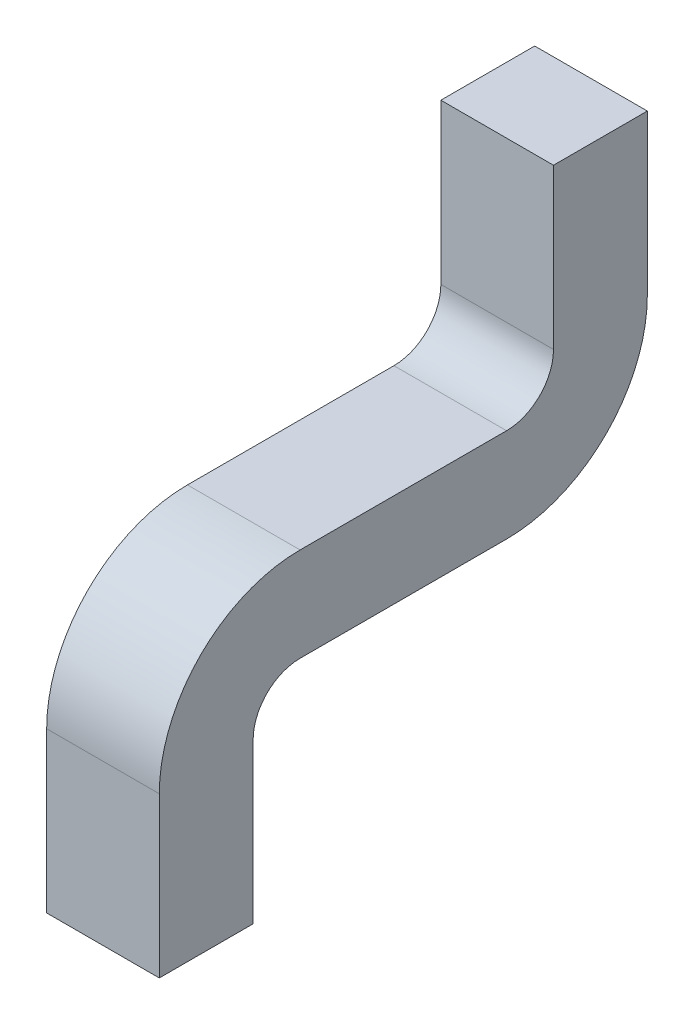
ISO-10303-21;
HEADER;
FILE_DESCRIPTION(('STEP AP214'),'2;1');
FILE_NAME('part.step','',(''),(''),'','','');
FILE_SCHEMA(('AUTOMOTIVE_DESIGN { 1 0 10303 214 1 1 1 1 }'));
ENDSEC;
DATA;
#1=APPLICATION_CONTEXT('core data for automotive mechanical design processes');
#2=APPLICATION_PROTOCOL_DEFINITION('international standard','automotive_design',2000,#1);
#3=PRODUCT_CONTEXT('',#1,'mechanical');
#4=PRODUCT('Part','Part','',(#3));
#5=PRODUCT_RELATED_PRODUCT_CATEGORY('part','',(#4));
#6=PRODUCT_DEFINITION_FORMATION('','',#4);
#7=PRODUCT_DEFINITION_CONTEXT('part definition',#1,'design');
#8=PRODUCT_DEFINITION('design','',#6,#7);
#9=PRODUCT_DEFINITION_SHAPE('','',#8);
#10=(LENGTH_UNIT() NAMED_UNIT(*) SI_UNIT(.MILLI.,.METRE.));
#11=(NAMED_UNIT(*) PLANE_ANGLE_UNIT() SI_UNIT($,.RADIAN.));
#12=(NAMED_UNIT(*) SI_UNIT($,.STERADIAN.) SOLID_ANGLE_UNIT());
#13=UNCERTAINTY_MEASURE_WITH_UNIT(LENGTH_MEASURE(1.E-05),#10,'distance_accuracy_value','');
#14=(GEOMETRIC_REPRESENTATION_CONTEXT(3) GLOBAL_UNCERTAINTY_ASSIGNED_CONTEXT((#13)) GLOBAL_UNIT_ASSIGNED_CONTEXT((#10,
#11,#12)) REPRESENTATION_CONTEXT('',''));
#15=CARTESIAN_POINT('',(0.,0.,0.));
#16=DIRECTION('',(0.,0.,1.));
#17=DIRECTION('',(1.,0.,0.));
#18=AXIS2_PLACEMENT_3D('',#15,#16,#17);
#19=CARTESIAN_POINT('',(-2.125,0.,0.));
#20=DIRECTION('',(1.,0.,0.));
#21=DIRECTION('',(0.,1.,0.));
#22=AXIS2_PLACEMENT_3D('',#19,#20,#21);
#23=PLANE('',#22);
#24=DIRECTION('',(0.,0.,1.));
#25=VECTOR('',#24,1.);
#26=CARTESIAN_POINT('',(-2.125,2.75,1.075));
#27=LINE('',#26,#25);
#28=CARTESIAN_POINT('',(-2.125,2.75,0.95));
#29=VERTEX_POINT('',#28);
#30=CARTESIAN_POINT('',(-2.125,2.75,1.2));
#31=VERTEX_POINT('',#30);
#32=EDGE_CURVE('E11',#29,#31,#27,.T.);
#33=ORIENTED_EDGE('',*,*,#32,.F.);
#34=DIRECTION('',(0.,-1.,0.));
#35=VECTOR('',#34,1.);
#36=CARTESIAN_POINT('',(-2.125,2.9625,0.95));
#37=LINE('',#36,#35);
#38=CARTESIAN_POINT('',(-2.125,3.175,0.95));
#39=VERTEX_POINT('',#38);
#40=EDGE_CURVE('E24',#39,#29,#37,.T.);
#41=ORIENTED_EDGE('',*,*,#40,.F.);
#42=CARTESIAN_POINT('',(-2.125,3.175,0.825));
#43=DIRECTION('',(1.,0.,0.));
#44=DIRECTION('',(0.,-1.,0.));
#45=AXIS2_PLACEMENT_3D('',#42,#43,#44);
#46=CIRCLE('',#45,0.125);
#47=CARTESIAN_POINT('',(-2.125,3.3,0.825));
#48=VERTEX_POINT('',#47);
#49=EDGE_CURVE('E172',#48,#39,#46,.T.);
#50=ORIENTED_EDGE('',*,*,#49,.F.);
#51=DIRECTION('',(0.,0.,1.));
#52=VECTOR('',#51,1.);
#53=CARTESIAN_POINT('',(-2.125,3.3,0.55));
#54=LINE('',#53,#52);
#55=CARTESIAN_POINT('',(-2.125,3.3,0.275));
#56=VERTEX_POINT('',#55);
#57=EDGE_CURVE('E169',#56,#48,#54,.T.);
#58=ORIENTED_EDGE('',*,*,#57,.F.);
#59=CARTESIAN_POINT('',(-2.125,3.675,0.275));
#60=DIRECTION('',(-1.,0.,0.));
#61=DIRECTION('',(0.,-1.,0.));
#62=AXIS2_PLACEMENT_3D('',#59,#60,#61);
#63=CIRCLE('',#62,0.375);
#64=CARTESIAN_POINT('',(-2.125,3.675,-0.1));
#65=VERTEX_POINT('',#64);
#66=EDGE_CURVE('E166',#65,#56,#63,.T.);
#67=ORIENTED_EDGE('',*,*,#66,.F.);
#68=DIRECTION('',(0.,-1.,0.));
#69=VECTOR('',#68,1.);
#70=CARTESIAN_POINT('',(-2.125,3.8875,-0.1));
#71=LINE('',#70,#69);
#72=CARTESIAN_POINT('',(-2.125,4.1,-0.1));
#73=VERTEX_POINT('',#72);
#74=EDGE_CURVE('E163',#73,#65,#71,.T.);
#75=ORIENTED_EDGE('',*,*,#74,.F.);
#76=DIRECTION('',(0.,0.,-1.));
#77=VECTOR('',#76,1.);
#78=CARTESIAN_POINT('',(-2.125,4.1,0.0249999999999998));
#79=LINE('',#78,#77);
#80=CARTESIAN_POINT('',(-2.125,4.1,0.15));
#81=VERTEX_POINT('',#80);
#82=EDGE_CURVE('E160',#81,#73,#79,.T.);
#83=ORIENTED_EDGE('',*,*,#82,.F.);
#84=DIRECTION('',(0.,1.,0.));
#85=VECTOR('',#84,1.);
#86=CARTESIAN_POINT('',(-2.125,3.8875,0.15));
#87=LINE('',#86,#85);
#88=CARTESIAN_POINT('',(-2.125,3.675,0.15));
#89=VERTEX_POINT('',#88);
#90=EDGE_CURVE('E157',#89,#81,#87,.T.);
#91=ORIENTED_EDGE('',*,*,#90,.F.);
#92=CARTESIAN_POINT('',(-2.125,3.675,0.275));
#93=DIRECTION('',(1.,0.,0.));
#94=DIRECTION('',(0.,-1.,0.));
#95=AXIS2_PLACEMENT_3D('',#92,#93,#94);
#96=CIRCLE('',#95,0.125);
#97=CARTESIAN_POINT('',(-2.125,3.55,0.275));
#98=VERTEX_POINT('',#97);
#99=EDGE_CURVE('E154',#98,#89,#96,.T.);
#100=ORIENTED_EDGE('',*,*,#99,.F.);
#101=DIRECTION('',(0.,0.,-1.));
#102=VECTOR('',#101,1.);
#103=CARTESIAN_POINT('',(-2.125,3.55,0.55));
#104=LINE('',#103,#102);
#105=CARTESIAN_POINT('',(-2.125,3.55,0.825));
#106=VERTEX_POINT('',#105);
#107=EDGE_CURVE('E151',#106,#98,#104,.T.);
#108=ORIENTED_EDGE('',*,*,#107,.F.);
#109=CARTESIAN_POINT('',(-2.125,3.175,0.825));
#110=DIRECTION('',(-1.,0.,0.));
#111=DIRECTION('',(0.,-1.,0.));
#112=AXIS2_PLACEMENT_3D('',#109,#110,#111);
#113=CIRCLE('',#112,0.375);
#114=CARTESIAN_POINT('',(-2.125,3.175,1.2));
#115=VERTEX_POINT('',#114);
#116=EDGE_CURVE('E148',#115,#106,#113,.T.);
#117=ORIENTED_EDGE('',*,*,#116,.F.);
#118=DIRECTION('',(0.,1.,0.));
#119=VECTOR('',#118,1.);
#120=CARTESIAN_POINT('',(-2.125,2.9625,1.2));
#121=LINE('',#120,#119);
#122=EDGE_CURVE('E145',#31,#115,#121,.T.);
#123=ORIENTED_EDGE('',*,*,#122,.F.);
#124=EDGE_LOOP('',(#33,#41,#50,#58,#67,#75,#83,#91,#100,#108,#117,#123));
#125=FACE_BOUND('',#124,.T.);
#126=ADVANCED_FACE('F17',(#125),#23,.T.);
#127=CARTESIAN_POINT('',(-2.425,0.,0.));
#128=DIRECTION('',(1.,0.,0.));
#129=DIRECTION('',(0.,1.,0.));
#130=AXIS2_PLACEMENT_3D('',#127,#128,#129);
#131=PLANE('',#130);
#132=DIRECTION('',(0.,1.,0.));
#133=VECTOR('',#132,1.);
#134=CARTESIAN_POINT('',(-2.425,2.9625,1.2));
#135=LINE('',#134,#133);
#136=CARTESIAN_POINT('',(-2.425,2.75,1.2));
#137=VERTEX_POINT('',#136);
#138=CARTESIAN_POINT('',(-2.425,3.175,1.2));
#139=VERTEX_POINT('',#138);
#140=EDGE_CURVE('E143',#137,#139,#135,.T.);
#141=ORIENTED_EDGE('',*,*,#140,.T.);
#142=CARTESIAN_POINT('',(-2.425,3.175,0.825));
#143=DIRECTION('',(-1.,0.,0.));
#144=DIRECTION('',(0.,-1.,0.));
#145=AXIS2_PLACEMENT_3D('',#142,#143,#144);
#146=CIRCLE('',#145,0.375);
#147=CARTESIAN_POINT('',(-2.425,3.55,0.825));
#148=VERTEX_POINT('',#147);
#149=EDGE_CURVE('E141',#139,#148,#146,.T.);
#150=ORIENTED_EDGE('',*,*,#149,.T.);
#151=DIRECTION('',(0.,0.,-1.));
#152=VECTOR('',#151,1.);
#153=CARTESIAN_POINT('',(-2.425,3.55,0.55));
#154=LINE('',#153,#152);
#155=CARTESIAN_POINT('',(-2.425,3.55,0.275));
#156=VERTEX_POINT('',#155);
#157=EDGE_CURVE('E139',#148,#156,#154,.T.);
#158=ORIENTED_EDGE('',*,*,#157,.T.);
#159=CARTESIAN_POINT('',(-2.425,3.675,0.275));
#160=DIRECTION('',(1.,0.,0.));
#161=DIRECTION('',(0.,-1.,0.));
#162=AXIS2_PLACEMENT_3D('',#159,#160,#161);
#163=CIRCLE('',#162,0.125);
#164=CARTESIAN_POINT('',(-2.425,3.675,0.15));
#165=VERTEX_POINT('',#164);
#166=EDGE_CURVE('E137',#156,#165,#163,.T.);
#167=ORIENTED_EDGE('',*,*,#166,.T.);
#168=DIRECTION('',(0.,1.,0.));
#169=VECTOR('',#168,1.);
#170=CARTESIAN_POINT('',(-2.425,3.8875,0.15));
#171=LINE('',#170,#169);
#172=CARTESIAN_POINT('',(-2.425,4.1,0.15));
#173=VERTEX_POINT('',#172);
#174=EDGE_CURVE('E135',#165,#173,#171,.T.);
#175=ORIENTED_EDGE('',*,*,#174,.T.);
#176=DIRECTION('',(0.,0.,-1.));
#177=VECTOR('',#176,1.);
#178=CARTESIAN_POINT('',(-2.425,4.1,0.0249999999999998));
#179=LINE('',#178,#177);
#180=CARTESIAN_POINT('',(-2.425,4.1,-0.1));
#181=VERTEX_POINT('',#180);
#182=EDGE_CURVE('E133',#173,#181,#179,.T.);
#183=ORIENTED_EDGE('',*,*,#182,.T.);
#184=DIRECTION('',(0.,-1.,0.));
#185=VECTOR('',#184,1.);
#186=CARTESIAN_POINT('',(-2.425,3.8875,-0.1));
#187=LINE('',#186,#185);
#188=CARTESIAN_POINT('',(-2.425,3.675,-0.1));
#189=VERTEX_POINT('',#188);
#190=EDGE_CURVE('E131',#181,#189,#187,.T.);
#191=ORIENTED_EDGE('',*,*,#190,.T.);
#192=CARTESIAN_POINT('',(-2.425,3.675,0.275));
#193=DIRECTION('',(-1.,0.,0.));
#194=DIRECTION('',(0.,-1.,0.));
#195=AXIS2_PLACEMENT_3D('',#192,#193,#194);
#196=CIRCLE('',#195,0.375);
#197=CARTESIAN_POINT('',(-2.425,3.3,0.275));
#198=VERTEX_POINT('',#197);
#199=EDGE_CURVE('E129',#189,#198,#196,.T.);
#200=ORIENTED_EDGE('',*,*,#199,.T.);
#201=DIRECTION('',(0.,0.,1.));
#202=VECTOR('',#201,1.);
#203=CARTESIAN_POINT('',(-2.425,3.3,0.55));
#204=LINE('',#203,#202);
#205=CARTESIAN_POINT('',(-2.425,3.3,0.825));
#206=VERTEX_POINT('',#205);
#207=EDGE_CURVE('E127',#198,#206,#204,.T.);
#208=ORIENTED_EDGE('',*,*,#207,.T.);
#209=CARTESIAN_POINT('',(-2.425,3.175,0.825));
#210=DIRECTION('',(1.,0.,0.));
#211=DIRECTION('',(0.,-1.,0.));
#212=AXIS2_PLACEMENT_3D('',#209,#210,#211);
#213=CIRCLE('',#212,0.125);
#214=CARTESIAN_POINT('',(-2.425,3.175,0.95));
#215=VERTEX_POINT('',#214);
#216=EDGE_CURVE('E107',#206,#215,#213,.T.);
#217=ORIENTED_EDGE('',*,*,#216,.T.);
#218=DIRECTION('',(0.,-1.,0.));
#219=VECTOR('',#218,1.);
#220=CARTESIAN_POINT('',(-2.425,2.9625,0.95));
#221=LINE('',#220,#219);
#222=CARTESIAN_POINT('',(-2.425,2.75,0.95));
#223=VERTEX_POINT('',#222);
#224=EDGE_CURVE('E102',#215,#223,#221,.T.);
#225=ORIENTED_EDGE('',*,*,#224,.T.);
#226=DIRECTION('',(0.,0.,1.));
#227=VECTOR('',#226,1.);
#228=CARTESIAN_POINT('',(-2.425,2.75,1.075));
#229=LINE('',#228,#227);
#230=EDGE_CURVE('E105',#223,#137,#229,.T.);
#231=ORIENTED_EDGE('',*,*,#230,.T.);
#232=EDGE_LOOP('',(#141,#150,#158,#167,#175,#183,#191,#200,#208,#217,#225,#231));
#233=FACE_BOUND('',#232,.T.);
#234=ADVANCED_FACE('F104',(#233),#131,.F.);
#235=CARTESIAN_POINT('',(-3.575,2.75,1.2));
#236=DIRECTION('',(0.,-1.,0.));
#237=DIRECTION('',(0.,0.,-1.));
#238=AXIS2_PLACEMENT_3D('',#235,#236,#237);
#239=PLANE('',#238);
#240=ORIENTED_EDGE('',*,*,#32,.T.);
#241=DIRECTION('',(1.,0.,0.));
#242=VECTOR('',#241,1.);
#243=CARTESIAN_POINT('',(-2.275,2.75,1.2));
#244=LINE('',#243,#242);
#245=EDGE_CURVE('E116',#137,#31,#244,.T.);
#246=ORIENTED_EDGE('',*,*,#245,.F.);
#247=ORIENTED_EDGE('',*,*,#230,.F.);
#248=DIRECTION('',(1.,0.,0.));
#249=VECTOR('',#248,1.);
#250=CARTESIAN_POINT('',(-2.275,2.75,0.95));
#251=LINE('',#250,#249);
#252=EDGE_CURVE('E114',#223,#29,#251,.T.);
#253=ORIENTED_EDGE('',*,*,#252,.T.);
#254=EDGE_LOOP('',(#240,#246,#247,#253));
#255=FACE_BOUND('',#254,.T.);
#256=ADVANCED_FACE('F113',(#255),#239,.T.);
#257=CARTESIAN_POINT('',(-3.575,-2.75,0.95));
#258=DIRECTION('',(0.,0.,1.));
#259=DIRECTION('',(0.,-1.,0.));
#260=AXIS2_PLACEMENT_3D('',#257,#258,#259);
#261=PLANE('',#260);
#262=ORIENTED_EDGE('',*,*,#40,.T.);
#263=ORIENTED_EDGE('',*,*,#252,.F.);
#264=ORIENTED_EDGE('',*,*,#224,.F.);
#265=DIRECTION('',(1.,0.,0.));
#266=VECTOR('',#265,1.);
#267=CARTESIAN_POINT('',(-3.575,3.175,0.95));
#268=LINE('',#267,#266);
#269=EDGE_CURVE('E119',#215,#39,#268,.T.);
#270=ORIENTED_EDGE('',*,*,#269,.T.);
#271=EDGE_LOOP('',(#262,#263,#264,#270));
#272=FACE_BOUND('',#271,.T.);
#273=ADVANCED_FACE('F118',(#272),#261,.F.);
#274=CARTESIAN_POINT('',(-3.575,3.175,0.825));
#275=DIRECTION('',(1.,0.,0.));
#276=DIRECTION('',(0.,-1.,0.));
#277=AXIS2_PLACEMENT_3D('',#274,#275,#276);
#278=CYLINDRICAL_SURFACE('',#277,0.125);
#279=ORIENTED_EDGE('',*,*,#49,.T.);
#280=ORIENTED_EDGE('',*,*,#269,.F.);
#281=ORIENTED_EDGE('',*,*,#216,.F.);
#282=DIRECTION('',(1.,0.,0.));
#283=VECTOR('',#282,1.);
#284=CARTESIAN_POINT('',(-2.275,3.3,0.825));
#285=LINE('',#284,#283);
#286=EDGE_CURVE('E122',#206,#48,#285,.T.);
#287=ORIENTED_EDGE('',*,*,#286,.T.);
#288=EDGE_LOOP('',(#279,#280,#281,#287));
#289=FACE_BOUND('',#288,.T.);
#290=ADVANCED_FACE('F176',(#289),#278,.F.);
#291=CARTESIAN_POINT('',(-3.575,3.3,0.825));
#292=DIRECTION('',(0.,-1.,0.));
#293=DIRECTION('',(0.,0.,-1.));
#294=AXIS2_PLACEMENT_3D('',#291,#292,#293);
#295=PLANE('',#294);
#296=ORIENTED_EDGE('',*,*,#57,.T.);
#297=ORIENTED_EDGE('',*,*,#286,.F.);
#298=ORIENTED_EDGE('',*,*,#207,.F.);
#299=DIRECTION('',(1.,0.,0.));
#300=VECTOR('',#299,1.);
#301=CARTESIAN_POINT('',(-3.575,3.3,0.275));
#302=LINE('',#301,#300);
#303=EDGE_CURVE('E183',#198,#56,#302,.T.);
#304=ORIENTED_EDGE('',*,*,#303,.T.);
#305=EDGE_LOOP('',(#296,#297,#298,#304));
#306=FACE_BOUND('',#305,.T.);
#307=ADVANCED_FACE('F180',(#306),#295,.T.);
#308=CARTESIAN_POINT('',(-3.575,3.675,0.275));
#309=DIRECTION('',(1.,0.,0.));
#310=DIRECTION('',(0.,-1.,0.));
#311=AXIS2_PLACEMENT_3D('',#308,#309,#310);
#312=CYLINDRICAL_SURFACE('',#311,0.375);
#313=ORIENTED_EDGE('',*,*,#66,.T.);
#314=ORIENTED_EDGE('',*,*,#303,.F.);
#315=ORIENTED_EDGE('',*,*,#199,.F.);
#316=DIRECTION('',(1.,0.,0.));
#317=VECTOR('',#316,1.);
#318=CARTESIAN_POINT('',(-2.275,3.675,-0.1));
#319=LINE('',#318,#317);
#320=EDGE_CURVE('E186',#189,#65,#319,.T.);
#321=ORIENTED_EDGE('',*,*,#320,.T.);
#322=EDGE_LOOP('',(#313,#314,#315,#321));
#323=FACE_BOUND('',#322,.T.);
#324=ADVANCED_FACE('F235',(#323),#312,.T.);
#325=CARTESIAN_POINT('',(-3.575,-3.675,-0.1));
#326=DIRECTION('',(0.,0.,1.));
#327=DIRECTION('',(0.,-1.,0.));
#328=AXIS2_PLACEMENT_3D('',#325,#326,#327);
#329=PLANE('',#328);
#330=ORIENTED_EDGE('',*,*,#74,.T.);
#331=ORIENTED_EDGE('',*,*,#320,.F.);
#332=ORIENTED_EDGE('',*,*,#190,.F.);
#333=DIRECTION('',(1.,0.,0.));
#334=VECTOR('',#333,1.);
#335=CARTESIAN_POINT('',(-2.275,4.1,-0.1));
#336=LINE('',#335,#334);
#337=EDGE_CURVE('E189',#181,#73,#336,.T.);
#338=ORIENTED_EDGE('',*,*,#337,.T.);
#339=EDGE_LOOP('',(#330,#331,#332,#338));
#340=FACE_BOUND('',#339,.T.);
#341=ADVANCED_FACE('F234',(#340),#329,.F.);
#342=CARTESIAN_POINT('',(-3.575,4.1,-0.1));
#343=DIRECTION('',(0.,1.,0.));
#344=DIRECTION('',(0.,0.,1.));
#345=AXIS2_PLACEMENT_3D('',#342,#343,#344);
#346=PLANE('',#345);
#347=ORIENTED_EDGE('',*,*,#82,.T.);
#348=ORIENTED_EDGE('',*,*,#337,.F.);
#349=ORIENTED_EDGE('',*,*,#182,.F.);
#350=DIRECTION('',(1.,0.,0.));
#351=VECTOR('',#350,1.);
#352=CARTESIAN_POINT('',(-2.275,4.1,0.15));
#353=LINE('',#352,#351);
#354=EDGE_CURVE('E194',#173,#81,#353,.T.);
#355=ORIENTED_EDGE('',*,*,#354,.T.);
#356=EDGE_LOOP('',(#347,#348,#349,#355));
#357=FACE_BOUND('',#356,.T.);
#358=ADVANCED_FACE('F229',(#357),#346,.T.);
#359=CARTESIAN_POINT('',(-3.575,-4.1,0.15));
#360=DIRECTION('',(0.,0.,-1.));
#361=DIRECTION('',(0.,1.,0.));
#362=AXIS2_PLACEMENT_3D('',#359,#360,#361);
#363=PLANE('',#362);
#364=ORIENTED_EDGE('',*,*,#90,.T.);
#365=ORIENTED_EDGE('',*,*,#354,.F.);
#366=ORIENTED_EDGE('',*,*,#174,.F.);
#367=DIRECTION('',(1.,0.,0.));
#368=VECTOR('',#367,1.);
#369=CARTESIAN_POINT('',(-3.575,3.675,0.15));
#370=LINE('',#369,#368);
#371=EDGE_CURVE('E197',#165,#89,#370,.T.);
#372=ORIENTED_EDGE('',*,*,#371,.T.);
#373=EDGE_LOOP('',(#364,#365,#366,#372));
#374=FACE_BOUND('',#373,.T.);
#375=ADVANCED_FACE('F227',(#374),#363,.F.);
#376=CARTESIAN_POINT('',(-3.575,3.675,0.275));
#377=DIRECTION('',(1.,0.,0.));
#378=DIRECTION('',(0.,-1.,0.));
#379=AXIS2_PLACEMENT_3D('',#376,#377,#378);
#380=CYLINDRICAL_SURFACE('',#379,0.125);
#381=ORIENTED_EDGE('',*,*,#99,.T.);
#382=ORIENTED_EDGE('',*,*,#371,.F.);
#383=ORIENTED_EDGE('',*,*,#166,.F.);
#384=DIRECTION('',(1.,0.,0.));
#385=VECTOR('',#384,1.);
#386=CARTESIAN_POINT('',(-2.275,3.55,0.275));
#387=LINE('',#386,#385);
#388=EDGE_CURVE('E200',#156,#98,#387,.T.);
#389=ORIENTED_EDGE('',*,*,#388,.T.);
#390=EDGE_LOOP('',(#381,#382,#383,#389));
#391=FACE_BOUND('',#390,.T.);
#392=ADVANCED_FACE('F221',(#391),#380,.F.);
#393=CARTESIAN_POINT('',(-3.575,3.55,0.275));
#394=DIRECTION('',(0.,1.,0.));
#395=DIRECTION('',(0.,0.,1.));
#396=AXIS2_PLACEMENT_3D('',#393,#394,#395);
#397=PLANE('',#396);
#398=ORIENTED_EDGE('',*,*,#107,.T.);
#399=ORIENTED_EDGE('',*,*,#388,.F.);
#400=ORIENTED_EDGE('',*,*,#157,.F.);
#401=DIRECTION('',(1.,0.,0.));
#402=VECTOR('',#401,1.);
#403=CARTESIAN_POINT('',(-3.575,3.55,0.825));
#404=LINE('',#403,#402);
#405=EDGE_CURVE('E203',#148,#106,#404,.T.);
#406=ORIENTED_EDGE('',*,*,#405,.T.);
#407=EDGE_LOOP('',(#398,#399,#400,#406));
#408=FACE_BOUND('',#407,.T.);
#409=ADVANCED_FACE('F217',(#408),#397,.T.);
#410=CARTESIAN_POINT('',(-3.575,3.175,0.825));
#411=DIRECTION('',(1.,0.,0.));
#412=DIRECTION('',(0.,-1.,0.));
#413=AXIS2_PLACEMENT_3D('',#410,#411,#412);
#414=CYLINDRICAL_SURFACE('',#413,0.375);
#415=ORIENTED_EDGE('',*,*,#116,.T.);
#416=ORIENTED_EDGE('',*,*,#405,.F.);
#417=ORIENTED_EDGE('',*,*,#149,.F.);
#418=DIRECTION('',(1.,0.,0.));
#419=VECTOR('',#418,1.);
#420=CARTESIAN_POINT('',(-2.275,3.175,1.2));
#421=LINE('',#420,#419);
#422=EDGE_CURVE('E206',#139,#115,#421,.T.);
#423=ORIENTED_EDGE('',*,*,#422,.T.);
#424=EDGE_LOOP('',(#415,#416,#417,#423));
#425=FACE_BOUND('',#424,.T.);
#426=ADVANCED_FACE('F211',(#425),#414,.T.);
#427=CARTESIAN_POINT('',(-3.575,-3.175,1.2));
#428=DIRECTION('',(0.,0.,-1.));
#429=DIRECTION('',(0.,1.,0.));
#430=AXIS2_PLACEMENT_3D('',#427,#428,#429);
#431=PLANE('',#430);
#432=ORIENTED_EDGE('',*,*,#122,.T.);
#433=ORIENTED_EDGE('',*,*,#422,.F.);
#434=ORIENTED_EDGE('',*,*,#140,.F.);
#435=ORIENTED_EDGE('',*,*,#245,.T.);
#436=EDGE_LOOP('',(#432,#433,#434,#435));
#437=FACE_BOUND('',#436,.T.);
#438=ADVANCED_FACE('F214',(#437),#431,.F.);
#439=CLOSED_SHELL('',(#126,#234,#256,#273,#290,#307,#324,#341,#358,#375,#392,#409,#426,#438));
#440=MANIFOLD_SOLID_BREP('B1',#439);
#441=ADVANCED_BREP_SHAPE_REPRESENTATION('',(#18,#440),#14);
#442=SHAPE_DEFINITION_REPRESENTATION(#9,#441);
ENDSEC;
END-ISO-10303-21;
